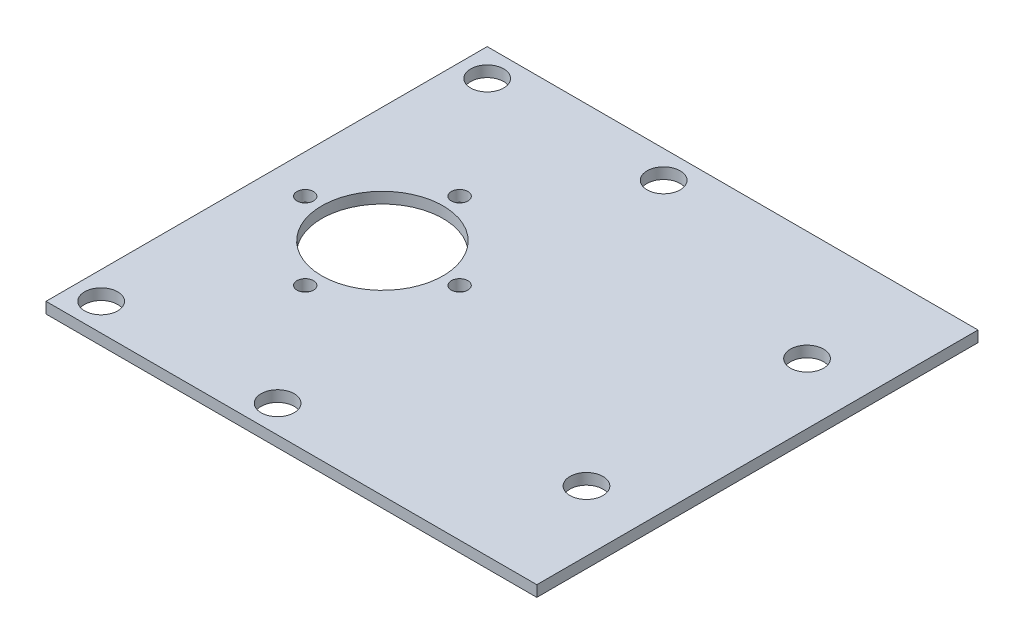
ISO-10303-21;
HEADER;
FILE_DESCRIPTION(('STEP AP214'),'2;1');
FILE_NAME('part.step','',(''),(''),'','','');
FILE_SCHEMA(('AUTOMOTIVE_DESIGN { 1 0 10303 214 1 1 1 1 }'));
ENDSEC;
DATA;
#1=APPLICATION_CONTEXT('core data for automotive mechanical design processes');
#2=APPLICATION_PROTOCOL_DEFINITION('international standard','automotive_design',2000,#1);
#3=PRODUCT_CONTEXT('',#1,'mechanical');
#4=PRODUCT('Part','Part','',(#3));
#5=PRODUCT_RELATED_PRODUCT_CATEGORY('part','',(#4));
#6=PRODUCT_DEFINITION_FORMATION('','',#4);
#7=PRODUCT_DEFINITION_CONTEXT('part definition',#1,'design');
#8=PRODUCT_DEFINITION('design','',#6,#7);
#9=PRODUCT_DEFINITION_SHAPE('','',#8);
#10=(LENGTH_UNIT() NAMED_UNIT(*) SI_UNIT(.MILLI.,.METRE.));
#11=(NAMED_UNIT(*) PLANE_ANGLE_UNIT() SI_UNIT($,.RADIAN.));
#12=(NAMED_UNIT(*) SI_UNIT($,.STERADIAN.) SOLID_ANGLE_UNIT());
#13=UNCERTAINTY_MEASURE_WITH_UNIT(LENGTH_MEASURE(1.E-05),#10,'distance_accuracy_value','');
#14=(GEOMETRIC_REPRESENTATION_CONTEXT(3) GLOBAL_UNCERTAINTY_ASSIGNED_CONTEXT((#13)) GLOBAL_UNIT_ASSIGNED_CONTEXT((#10,
#11,#12)) REPRESENTATION_CONTEXT('',''));
#15=CARTESIAN_POINT('',(0.,0.,0.));
#16=DIRECTION('',(0.,0.,1.));
#17=DIRECTION('',(1.,0.,0.));
#18=AXIS2_PLACEMENT_3D('',#15,#16,#17);
#19=CARTESIAN_POINT('',(0.,2.,0.));
#20=DIRECTION('',(1.,0.,0.));
#21=DIRECTION('',(0.,0.,-1.));
#22=AXIS2_PLACEMENT_3D('',#19,#20,#21);
#23=PLANE('',#22);
#24=DIRECTION('',(0.,0.,1.));
#25=VECTOR('',#24,1.);
#26=CARTESIAN_POINT('',(0.,0.,0.));
#27=LINE('',#26,#25);
#28=CARTESIAN_POINT('',(0.,0.,-80.));
#29=VERTEX_POINT('',#28);
#30=CARTESIAN_POINT('',(0.,0.,0.));
#31=VERTEX_POINT('',#30);
#32=EDGE_CURVE('E97',#29,#31,#27,.T.);
#33=ORIENTED_EDGE('',*,*,#32,.T.);
#34=DIRECTION('',(0.,-1.,0.));
#35=VECTOR('',#34,1.);
#36=CARTESIAN_POINT('',(0.,2.,0.));
#37=LINE('',#36,#35);
#38=CARTESIAN_POINT('',(0.,2.,0.));
#39=VERTEX_POINT('',#38);
#40=EDGE_CURVE('E11',#39,#31,#37,.T.);
#41=ORIENTED_EDGE('',*,*,#40,.F.);
#42=DIRECTION('',(0.,0.,1.));
#43=VECTOR('',#42,1.);
#44=CARTESIAN_POINT('',(0.,2.,0.));
#45=LINE('',#44,#43);
#46=CARTESIAN_POINT('',(0.,2.,-80.));
#47=VERTEX_POINT('',#46);
#48=EDGE_CURVE('E85',#47,#39,#45,.T.);
#49=ORIENTED_EDGE('',*,*,#48,.F.);
#50=DIRECTION('',(0.,-1.,0.));
#51=VECTOR('',#50,1.);
#52=CARTESIAN_POINT('',(0.,2.,-80.));
#53=LINE('',#52,#51);
#54=EDGE_CURVE('E93',#47,#29,#53,.T.);
#55=ORIENTED_EDGE('',*,*,#54,.T.);
#56=EDGE_LOOP('',(#33,#41,#49,#55));
#57=FACE_BOUND('',#56,.T.);
#58=ADVANCED_FACE('F34',(#57),#23,.F.);
#59=CARTESIAN_POINT('',(0.,2.,0.));
#60=DIRECTION('',(0.,0.,-1.));
#61=DIRECTION('',(-1.,0.,0.));
#62=AXIS2_PLACEMENT_3D('',#59,#60,#61);
#63=PLANE('',#62);
#64=DIRECTION('',(1.,0.,0.));
#65=VECTOR('',#64,1.);
#66=CARTESIAN_POINT('',(0.,0.,0.));
#67=LINE('',#66,#65);
#68=CARTESIAN_POINT('',(89.,0.,0.));
#69=VERTEX_POINT('',#68);
#70=EDGE_CURVE('E89',#31,#69,#67,.T.);
#71=ORIENTED_EDGE('',*,*,#70,.T.);
#72=DIRECTION('',(0.,-1.,0.));
#73=VECTOR('',#72,1.);
#74=CARTESIAN_POINT('',(89.,2.,0.));
#75=LINE('',#74,#73);
#76=CARTESIAN_POINT('',(89.,2.,0.));
#77=VERTEX_POINT('',#76);
#78=EDGE_CURVE('E42',#77,#69,#75,.T.);
#79=ORIENTED_EDGE('',*,*,#78,.F.);
#80=DIRECTION('',(1.,0.,0.));
#81=VECTOR('',#80,1.);
#82=CARTESIAN_POINT('',(0.,2.,0.));
#83=LINE('',#82,#81);
#84=EDGE_CURVE('E80',#39,#77,#83,.T.);
#85=ORIENTED_EDGE('',*,*,#84,.F.);
#86=ORIENTED_EDGE('',*,*,#40,.T.);
#87=EDGE_LOOP('',(#71,#79,#85,#86));
#88=FACE_BOUND('',#87,.T.);
#89=ADVANCED_FACE('F88',(#88),#63,.F.);
#90=CARTESIAN_POINT('',(89.,2.,0.));
#91=DIRECTION('',(-1.,0.,0.));
#92=DIRECTION('',(0.,0.,1.));
#93=AXIS2_PLACEMENT_3D('',#90,#91,#92);
#94=PLANE('',#93);
#95=DIRECTION('',(0.,0.,-1.));
#96=VECTOR('',#95,1.);
#97=CARTESIAN_POINT('',(89.,0.,0.));
#98=LINE('',#97,#96);
#99=CARTESIAN_POINT('',(89.,0.,-80.));
#100=VERTEX_POINT('',#99);
#101=EDGE_CURVE('E67',#69,#100,#98,.T.);
#102=ORIENTED_EDGE('',*,*,#101,.T.);
#103=DIRECTION('',(0.,-1.,0.));
#104=VECTOR('',#103,1.);
#105=CARTESIAN_POINT('',(89.,2.,-80.));
#106=LINE('',#105,#104);
#107=CARTESIAN_POINT('',(89.,2.,-80.));
#108=VERTEX_POINT('',#107);
#109=EDGE_CURVE('E90',#108,#100,#106,.T.);
#110=ORIENTED_EDGE('',*,*,#109,.F.);
#111=DIRECTION('',(0.,0.,-1.));
#112=VECTOR('',#111,1.);
#113=CARTESIAN_POINT('',(89.,2.,0.));
#114=LINE('',#113,#112);
#115=EDGE_CURVE('E83',#77,#108,#114,.T.);
#116=ORIENTED_EDGE('',*,*,#115,.F.);
#117=ORIENTED_EDGE('',*,*,#78,.T.);
#118=EDGE_LOOP('',(#102,#110,#116,#117));
#119=FACE_BOUND('',#118,.T.);
#120=ADVANCED_FACE('F91',(#119),#94,.F.);
#121=CARTESIAN_POINT('',(0.,2.,-80.));
#122=DIRECTION('',(0.,0.,1.));
#123=DIRECTION('',(1.,0.,0.));
#124=AXIS2_PLACEMENT_3D('',#121,#122,#123);
#125=PLANE('',#124);
#126=DIRECTION('',(-1.,0.,0.));
#127=VECTOR('',#126,1.);
#128=CARTESIAN_POINT('',(0.,0.,-80.));
#129=LINE('',#128,#127);
#130=EDGE_CURVE('E73',#100,#29,#129,.T.);
#131=ORIENTED_EDGE('',*,*,#130,.T.);
#132=ORIENTED_EDGE('',*,*,#54,.F.);
#133=DIRECTION('',(-1.,0.,0.));
#134=VECTOR('',#133,1.);
#135=CARTESIAN_POINT('',(0.,2.,-80.));
#136=LINE('',#135,#134);
#137=EDGE_CURVE('E50',#108,#47,#136,.T.);
#138=ORIENTED_EDGE('',*,*,#137,.F.);
#139=ORIENTED_EDGE('',*,*,#109,.T.);
#140=EDGE_LOOP('',(#131,#132,#138,#139));
#141=FACE_BOUND('',#140,.T.);
#142=ADVANCED_FACE('F105',(#141),#125,.F.);
#143=CARTESIAN_POINT('',(0.,2.,-80.));
#144=DIRECTION('',(0.,-1.,0.));
#145=DIRECTION('',(0.,0.,-1.));
#146=AXIS2_PLACEMENT_3D('',#143,#144,#145);
#147=PLANE('',#146);
#148=CARTESIAN_POINT('',(78.,2.,-20.));
#149=DIRECTION('',(0.,1.,0.));
#150=DIRECTION('',(0.,0.,-1.));
#151=AXIS2_PLACEMENT_3D('',#148,#149,#150);
#152=CIRCLE('',#151,3.00000000000001);
#153=CARTESIAN_POINT('',(78.,2.,-23.0000000000001));
#154=VERTEX_POINT('',#153);
#155=EDGE_CURVE('E171',#154,#154,#152,.T.);
#156=ORIENTED_EDGE('',*,*,#155,.F.);
#157=EDGE_LOOP('',(#156));
#158=FACE_BOUND('',#157,.T.);
#159=CARTESIAN_POINT('',(37.0000000000003,2.,-74.9999999999999));
#160=DIRECTION('',(0.,1.,0.));
#161=DIRECTION('',(0.,0.,-1.));
#162=AXIS2_PLACEMENT_3D('',#159,#160,#161);
#163=CIRCLE('',#162,3.00000000000001);
#164=CARTESIAN_POINT('',(37.0000000000003,2.,-77.9999999999999));
#165=VERTEX_POINT('',#164);
#166=EDGE_CURVE('E165',#165,#165,#163,.T.);
#167=ORIENTED_EDGE('',*,*,#166,.F.);
#168=EDGE_LOOP('',(#167));
#169=FACE_BOUND('',#168,.T.);
#170=CARTESIAN_POINT('',(37.,2.,-5.00000000000005));
#171=DIRECTION('',(0.,1.,0.));
#172=DIRECTION('',(0.,0.,1.));
#173=AXIS2_PLACEMENT_3D('',#170,#171,#172);
#174=CIRCLE('',#173,3.);
#175=CARTESIAN_POINT('',(37.,2.,-2.00000000000004));
#176=VERTEX_POINT('',#175);
#177=EDGE_CURVE('E159',#176,#176,#174,.T.);
#178=ORIENTED_EDGE('',*,*,#177,.F.);
#179=EDGE_LOOP('',(#178));
#180=FACE_BOUND('',#179,.T.);
#181=CARTESIAN_POINT('',(4.99999999999992,2.,-5.00000000000013));
#182=DIRECTION('',(0.,1.,0.));
#183=DIRECTION('',(0.,0.,-1.));
#184=AXIS2_PLACEMENT_3D('',#181,#182,#183);
#185=CIRCLE('',#184,3.);
#186=CARTESIAN_POINT('',(4.99999999999992,2.,-8.00000000000013));
#187=VERTEX_POINT('',#186);
#188=EDGE_CURVE('E153',#187,#187,#185,.T.);
#189=ORIENTED_EDGE('',*,*,#188,.F.);
#190=EDGE_LOOP('',(#189));
#191=FACE_BOUND('',#190,.T.);
#192=CARTESIAN_POINT('',(78.,2.,-60.));
#193=DIRECTION('',(0.,1.,0.));
#194=DIRECTION('',(0.,0.,1.));
#195=AXIS2_PLACEMENT_3D('',#192,#193,#194);
#196=CIRCLE('',#195,3.00000000000001);
#197=CARTESIAN_POINT('',(78.,2.,-57.));
#198=VERTEX_POINT('',#197);
#199=EDGE_CURVE('E147',#198,#198,#196,.T.);
#200=ORIENTED_EDGE('',*,*,#199,.F.);
#201=EDGE_LOOP('',(#200));
#202=FACE_BOUND('',#201,.T.);
#203=CARTESIAN_POINT('',(21.0000000000001,2.,-54.));
#204=DIRECTION('',(0.,1.,0.));
#205=DIRECTION('',(0.,0.,1.));
#206=AXIS2_PLACEMENT_3D('',#203,#204,#205);
#207=CIRCLE('',#206,1.5);
#208=CARTESIAN_POINT('',(21.0000000000001,2.,-52.5));
#209=VERTEX_POINT('',#208);
#210=EDGE_CURVE('E141',#209,#209,#207,.T.);
#211=ORIENTED_EDGE('',*,*,#210,.F.);
#212=EDGE_LOOP('',(#211));
#213=FACE_BOUND('',#212,.T.);
#214=CARTESIAN_POINT('',(7.00000000000001,2.,-40.0000000000001));
#215=DIRECTION('',(0.,1.,0.));
#216=DIRECTION('',(0.,0.,1.));
#217=AXIS2_PLACEMENT_3D('',#214,#215,#216);
#218=CIRCLE('',#217,1.5);
#219=CARTESIAN_POINT('',(7.00000000000001,2.,-38.5000000000001));
#220=VERTEX_POINT('',#219);
#221=EDGE_CURVE('E135',#220,#220,#218,.T.);
#222=ORIENTED_EDGE('',*,*,#221,.F.);
#223=EDGE_LOOP('',(#222));
#224=FACE_BOUND('',#223,.T.);
#225=CARTESIAN_POINT('',(21.,2.,-26.));
#226=DIRECTION('',(0.,1.,0.));
#227=DIRECTION('',(0.,0.,1.));
#228=AXIS2_PLACEMENT_3D('',#225,#226,#227);
#229=CIRCLE('',#228,1.5);
#230=CARTESIAN_POINT('',(21.,2.,-24.5));
#231=VERTEX_POINT('',#230);
#232=EDGE_CURVE('E129',#231,#231,#229,.T.);
#233=ORIENTED_EDGE('',*,*,#232,.F.);
#234=EDGE_LOOP('',(#233));
#235=FACE_BOUND('',#234,.T.);
#236=CARTESIAN_POINT('',(5.,2.,-75.));
#237=DIRECTION('',(0.,1.,0.));
#238=DIRECTION('',(0.,0.,1.));
#239=AXIS2_PLACEMENT_3D('',#236,#237,#238);
#240=CIRCLE('',#239,3.);
#241=CARTESIAN_POINT('',(5.,2.,-72.));
#242=VERTEX_POINT('',#241);
#243=EDGE_CURVE('E123',#242,#242,#240,.T.);
#244=ORIENTED_EDGE('',*,*,#243,.F.);
#245=EDGE_LOOP('',(#244));
#246=FACE_BOUND('',#245,.T.);
#247=CARTESIAN_POINT('',(35.,2.,-40.));
#248=DIRECTION('',(0.,1.,0.));
#249=DIRECTION('',(0.,0.,1.));
#250=AXIS2_PLACEMENT_3D('',#247,#248,#249);
#251=CIRCLE('',#250,1.5);
#252=CARTESIAN_POINT('',(35.,2.,-38.5));
#253=VERTEX_POINT('',#252);
#254=EDGE_CURVE('E117',#253,#253,#251,.T.);
#255=ORIENTED_EDGE('',*,*,#254,.F.);
#256=EDGE_LOOP('',(#255));
#257=FACE_BOUND('',#256,.T.);
#258=CARTESIAN_POINT('',(21.,2.,-40.));
#259=DIRECTION('',(0.,1.,0.));
#260=DIRECTION('',(0.,0.,1.));
#261=AXIS2_PLACEMENT_3D('',#258,#259,#260);
#262=CIRCLE('',#261,11.);
#263=CARTESIAN_POINT('',(21.,2.,-29.));
#264=VERTEX_POINT('',#263);
#265=EDGE_CURVE('E111',#264,#264,#262,.T.);
#266=ORIENTED_EDGE('',*,*,#265,.F.);
#267=EDGE_LOOP('',(#266));
#268=FACE_BOUND('',#267,.T.);
#269=ORIENTED_EDGE('',*,*,#48,.T.);
#270=ORIENTED_EDGE('',*,*,#84,.T.);
#271=ORIENTED_EDGE('',*,*,#115,.T.);
#272=ORIENTED_EDGE('',*,*,#137,.T.);
#273=EDGE_LOOP('',(#269,#270,#271,#272));
#274=FACE_BOUND('',#273,.T.);
#275=ADVANCED_FACE('F81',(#158,#169,#180,#191,#202,#213,#224,#235,#246,#257,#268,#274),#147,.F.);
#276=CARTESIAN_POINT('',(0.,0.,-80.));
#277=DIRECTION('',(0.,-1.,0.));
#278=DIRECTION('',(0.,0.,-1.));
#279=AXIS2_PLACEMENT_3D('',#276,#277,#278);
#280=PLANE('',#279);
#281=CARTESIAN_POINT('',(78.,0.,-20.));
#282=DIRECTION('',(0.,1.,0.));
#283=DIRECTION('',(0.,0.,-1.));
#284=AXIS2_PLACEMENT_3D('',#281,#282,#283);
#285=CIRCLE('',#284,3.00000000000001);
#286=CARTESIAN_POINT('',(78.,0.,-23.0000000000001));
#287=VERTEX_POINT('',#286);
#288=EDGE_CURVE('E168',#287,#287,#285,.T.);
#289=ORIENTED_EDGE('',*,*,#288,.T.);
#290=EDGE_LOOP('',(#289));
#291=FACE_BOUND('',#290,.T.);
#292=CARTESIAN_POINT('',(37.0000000000003,0.,-74.9999999999999));
#293=DIRECTION('',(0.,1.,0.));
#294=DIRECTION('',(0.,0.,-1.));
#295=AXIS2_PLACEMENT_3D('',#292,#293,#294);
#296=CIRCLE('',#295,3.00000000000001);
#297=CARTESIAN_POINT('',(37.0000000000003,0.,-77.9999999999999));
#298=VERTEX_POINT('',#297);
#299=EDGE_CURVE('E162',#298,#298,#296,.T.);
#300=ORIENTED_EDGE('',*,*,#299,.T.);
#301=EDGE_LOOP('',(#300));
#302=FACE_BOUND('',#301,.T.);
#303=CARTESIAN_POINT('',(37.,0.,-5.00000000000005));
#304=DIRECTION('',(0.,1.,0.));
#305=DIRECTION('',(0.,0.,1.));
#306=AXIS2_PLACEMENT_3D('',#303,#304,#305);
#307=CIRCLE('',#306,3.);
#308=CARTESIAN_POINT('',(37.,0.,-2.00000000000004));
#309=VERTEX_POINT('',#308);
#310=EDGE_CURVE('E156',#309,#309,#307,.T.);
#311=ORIENTED_EDGE('',*,*,#310,.T.);
#312=EDGE_LOOP('',(#311));
#313=FACE_BOUND('',#312,.T.);
#314=CARTESIAN_POINT('',(4.99999999999992,0.,-5.00000000000013));
#315=DIRECTION('',(0.,1.,0.));
#316=DIRECTION('',(0.,0.,-1.));
#317=AXIS2_PLACEMENT_3D('',#314,#315,#316);
#318=CIRCLE('',#317,3.);
#319=CARTESIAN_POINT('',(4.99999999999992,0.,-8.00000000000013));
#320=VERTEX_POINT('',#319);
#321=EDGE_CURVE('E150',#320,#320,#318,.T.);
#322=ORIENTED_EDGE('',*,*,#321,.T.);
#323=EDGE_LOOP('',(#322));
#324=FACE_BOUND('',#323,.T.);
#325=CARTESIAN_POINT('',(78.,0.,-60.));
#326=DIRECTION('',(0.,1.,0.));
#327=DIRECTION('',(0.,0.,1.));
#328=AXIS2_PLACEMENT_3D('',#325,#326,#327);
#329=CIRCLE('',#328,3.00000000000001);
#330=CARTESIAN_POINT('',(78.,0.,-57.));
#331=VERTEX_POINT('',#330);
#332=EDGE_CURVE('E144',#331,#331,#329,.T.);
#333=ORIENTED_EDGE('',*,*,#332,.T.);
#334=EDGE_LOOP('',(#333));
#335=FACE_BOUND('',#334,.T.);
#336=CARTESIAN_POINT('',(21.0000000000001,0.,-54.));
#337=DIRECTION('',(0.,1.,0.));
#338=DIRECTION('',(0.,0.,1.));
#339=AXIS2_PLACEMENT_3D('',#336,#337,#338);
#340=CIRCLE('',#339,1.5);
#341=CARTESIAN_POINT('',(21.0000000000001,0.,-52.5));
#342=VERTEX_POINT('',#341);
#343=EDGE_CURVE('E138',#342,#342,#340,.T.);
#344=ORIENTED_EDGE('',*,*,#343,.T.);
#345=EDGE_LOOP('',(#344));
#346=FACE_BOUND('',#345,.T.);
#347=CARTESIAN_POINT('',(7.00000000000001,0.,-40.0000000000001));
#348=DIRECTION('',(0.,1.,0.));
#349=DIRECTION('',(0.,0.,1.));
#350=AXIS2_PLACEMENT_3D('',#347,#348,#349);
#351=CIRCLE('',#350,1.5);
#352=CARTESIAN_POINT('',(7.00000000000001,0.,-38.5000000000001));
#353=VERTEX_POINT('',#352);
#354=EDGE_CURVE('E132',#353,#353,#351,.T.);
#355=ORIENTED_EDGE('',*,*,#354,.T.);
#356=EDGE_LOOP('',(#355));
#357=FACE_BOUND('',#356,.T.);
#358=CARTESIAN_POINT('',(21.,0.,-26.));
#359=DIRECTION('',(0.,1.,0.));
#360=DIRECTION('',(0.,0.,1.));
#361=AXIS2_PLACEMENT_3D('',#358,#359,#360);
#362=CIRCLE('',#361,1.5);
#363=CARTESIAN_POINT('',(21.,0.,-24.5));
#364=VERTEX_POINT('',#363);
#365=EDGE_CURVE('E126',#364,#364,#362,.T.);
#366=ORIENTED_EDGE('',*,*,#365,.T.);
#367=EDGE_LOOP('',(#366));
#368=FACE_BOUND('',#367,.T.);
#369=CARTESIAN_POINT('',(5.,0.,-75.));
#370=DIRECTION('',(0.,1.,0.));
#371=DIRECTION('',(0.,0.,1.));
#372=AXIS2_PLACEMENT_3D('',#369,#370,#371);
#373=CIRCLE('',#372,3.);
#374=CARTESIAN_POINT('',(5.,0.,-72.));
#375=VERTEX_POINT('',#374);
#376=EDGE_CURVE('E120',#375,#375,#373,.T.);
#377=ORIENTED_EDGE('',*,*,#376,.T.);
#378=EDGE_LOOP('',(#377));
#379=FACE_BOUND('',#378,.T.);
#380=CARTESIAN_POINT('',(35.,0.,-40.));
#381=DIRECTION('',(0.,1.,0.));
#382=DIRECTION('',(0.,0.,1.));
#383=AXIS2_PLACEMENT_3D('',#380,#381,#382);
#384=CIRCLE('',#383,1.5);
#385=CARTESIAN_POINT('',(35.,0.,-38.5));
#386=VERTEX_POINT('',#385);
#387=EDGE_CURVE('E114',#386,#386,#384,.T.);
#388=ORIENTED_EDGE('',*,*,#387,.T.);
#389=EDGE_LOOP('',(#388));
#390=FACE_BOUND('',#389,.T.);
#391=CARTESIAN_POINT('',(21.,0.,-40.));
#392=DIRECTION('',(0.,1.,0.));
#393=DIRECTION('',(0.,0.,1.));
#394=AXIS2_PLACEMENT_3D('',#391,#392,#393);
#395=CIRCLE('',#394,11.);
#396=CARTESIAN_POINT('',(21.,0.,-29.));
#397=VERTEX_POINT('',#396);
#398=EDGE_CURVE('E100',#397,#397,#395,.T.);
#399=ORIENTED_EDGE('',*,*,#398,.T.);
#400=EDGE_LOOP('',(#399));
#401=FACE_BOUND('',#400,.T.);
#402=ORIENTED_EDGE('',*,*,#32,.F.);
#403=ORIENTED_EDGE('',*,*,#130,.F.);
#404=ORIENTED_EDGE('',*,*,#101,.F.);
#405=ORIENTED_EDGE('',*,*,#70,.F.);
#406=EDGE_LOOP('',(#402,#403,#404,#405));
#407=FACE_BOUND('',#406,.T.);
#408=ADVANCED_FACE('F108',(#291,#302,#313,#324,#335,#346,#357,#368,#379,#390,#401,#407),#280,.T.);
#409=CARTESIAN_POINT('',(21.,0.,-40.));
#410=DIRECTION('',(0.,1.,0.));
#411=DIRECTION('',(0.,0.,1.));
#412=AXIS2_PLACEMENT_3D('',#409,#410,#411);
#413=CYLINDRICAL_SURFACE('',#412,11.);
#414=ORIENTED_EDGE('',*,*,#398,.F.);
#415=EDGE_LOOP('',(#414));
#416=FACE_BOUND('',#415,.T.);
#417=ORIENTED_EDGE('',*,*,#265,.T.);
#418=EDGE_LOOP('',(#417));
#419=FACE_BOUND('',#418,.T.);
#420=ADVANCED_FACE('F209',(#416,#419),#413,.F.);
#421=CARTESIAN_POINT('',(35.,0.,-40.));
#422=DIRECTION('',(0.,1.,0.));
#423=DIRECTION('',(0.,0.,1.));
#424=AXIS2_PLACEMENT_3D('',#421,#422,#423);
#425=CYLINDRICAL_SURFACE('',#424,1.5);
#426=ORIENTED_EDGE('',*,*,#387,.F.);
#427=EDGE_LOOP('',(#426));
#428=FACE_BOUND('',#427,.T.);
#429=ORIENTED_EDGE('',*,*,#254,.T.);
#430=EDGE_LOOP('',(#429));
#431=FACE_BOUND('',#430,.T.);
#432=ADVANCED_FACE('F211',(#428,#431),#425,.F.);
#433=CARTESIAN_POINT('',(5.,0.,-75.));
#434=DIRECTION('',(0.,1.,0.));
#435=DIRECTION('',(0.,0.,1.));
#436=AXIS2_PLACEMENT_3D('',#433,#434,#435);
#437=CYLINDRICAL_SURFACE('',#436,3.);
#438=ORIENTED_EDGE('',*,*,#376,.F.);
#439=EDGE_LOOP('',(#438));
#440=FACE_BOUND('',#439,.T.);
#441=ORIENTED_EDGE('',*,*,#243,.T.);
#442=EDGE_LOOP('',(#441));
#443=FACE_BOUND('',#442,.T.);
#444=ADVANCED_FACE('F218',(#440,#443),#437,.F.);
#445=CARTESIAN_POINT('',(21.,0.,-26.));
#446=DIRECTION('',(0.,1.,0.));
#447=DIRECTION('',(0.,0.,1.));
#448=AXIS2_PLACEMENT_3D('',#445,#446,#447);
#449=CYLINDRICAL_SURFACE('',#448,1.5);
#450=ORIENTED_EDGE('',*,*,#365,.F.);
#451=EDGE_LOOP('',(#450));
#452=FACE_BOUND('',#451,.T.);
#453=ORIENTED_EDGE('',*,*,#232,.T.);
#454=EDGE_LOOP('',(#453));
#455=FACE_BOUND('',#454,.T.);
#456=ADVANCED_FACE('F263',(#452,#455),#449,.F.);
#457=CARTESIAN_POINT('',(7.00000000000001,0.,-40.0000000000001));
#458=DIRECTION('',(0.,1.,0.));
#459=DIRECTION('',(0.,0.,1.));
#460=AXIS2_PLACEMENT_3D('',#457,#458,#459);
#461=CYLINDRICAL_SURFACE('',#460,1.5);
#462=ORIENTED_EDGE('',*,*,#354,.F.);
#463=EDGE_LOOP('',(#462));
#464=FACE_BOUND('',#463,.T.);
#465=ORIENTED_EDGE('',*,*,#221,.T.);
#466=EDGE_LOOP('',(#465));
#467=FACE_BOUND('',#466,.T.);
#468=ADVANCED_FACE('F273',(#464,#467),#461,.F.);
#469=CARTESIAN_POINT('',(21.0000000000001,0.,-54.));
#470=DIRECTION('',(0.,1.,0.));
#471=DIRECTION('',(0.,0.,1.));
#472=AXIS2_PLACEMENT_3D('',#469,#470,#471);
#473=CYLINDRICAL_SURFACE('',#472,1.5);
#474=ORIENTED_EDGE('',*,*,#343,.F.);
#475=EDGE_LOOP('',(#474));
#476=FACE_BOUND('',#475,.T.);
#477=ORIENTED_EDGE('',*,*,#210,.T.);
#478=EDGE_LOOP('',(#477));
#479=FACE_BOUND('',#478,.T.);
#480=ADVANCED_FACE('F283',(#476,#479),#473,.F.);
#481=CARTESIAN_POINT('',(78.,0.,-60.));
#482=DIRECTION('',(0.,1.,0.));
#483=DIRECTION('',(0.,0.,1.));
#484=AXIS2_PLACEMENT_3D('',#481,#482,#483);
#485=CYLINDRICAL_SURFACE('',#484,3.00000000000001);
#486=ORIENTED_EDGE('',*,*,#332,.F.);
#487=EDGE_LOOP('',(#486));
#488=FACE_BOUND('',#487,.T.);
#489=ORIENTED_EDGE('',*,*,#199,.T.);
#490=EDGE_LOOP('',(#489));
#491=FACE_BOUND('',#490,.T.);
#492=ADVANCED_FACE('F293',(#488,#491),#485,.F.);
#493=CARTESIAN_POINT('',(4.99999999999992,0.,-5.00000000000013));
#494=DIRECTION('',(0.,1.,0.));
#495=DIRECTION('',(0.,0.,1.));
#496=AXIS2_PLACEMENT_3D('',#493,#494,#495);
#497=CYLINDRICAL_SURFACE('',#496,3.);
#498=ORIENTED_EDGE('',*,*,#321,.F.);
#499=EDGE_LOOP('',(#498));
#500=FACE_BOUND('',#499,.T.);
#501=ORIENTED_EDGE('',*,*,#188,.T.);
#502=EDGE_LOOP('',(#501));
#503=FACE_BOUND('',#502,.T.);
#504=ADVANCED_FACE('F303',(#500,#503),#497,.F.);
#505=CARTESIAN_POINT('',(37.,0.,-5.00000000000005));
#506=DIRECTION('',(0.,1.,0.));
#507=DIRECTION('',(0.,0.,1.));
#508=AXIS2_PLACEMENT_3D('',#505,#506,#507);
#509=CYLINDRICAL_SURFACE('',#508,3.);
#510=ORIENTED_EDGE('',*,*,#310,.F.);
#511=EDGE_LOOP('',(#510));
#512=FACE_BOUND('',#511,.T.);
#513=ORIENTED_EDGE('',*,*,#177,.T.);
#514=EDGE_LOOP('',(#513));
#515=FACE_BOUND('',#514,.T.);
#516=ADVANCED_FACE('F313',(#512,#515),#509,.F.);
#517=CARTESIAN_POINT('',(37.0000000000003,0.,-74.9999999999999));
#518=DIRECTION('',(0.,1.,0.));
#519=DIRECTION('',(0.,0.,1.));
#520=AXIS2_PLACEMENT_3D('',#517,#518,#519);
#521=CYLINDRICAL_SURFACE('',#520,3.00000000000001);
#522=ORIENTED_EDGE('',*,*,#299,.F.);
#523=EDGE_LOOP('',(#522));
#524=FACE_BOUND('',#523,.T.);
#525=ORIENTED_EDGE('',*,*,#166,.T.);
#526=EDGE_LOOP('',(#525));
#527=FACE_BOUND('',#526,.T.);
#528=ADVANCED_FACE('F182',(#524,#527),#521,.F.);
#529=CARTESIAN_POINT('',(78.,0.,-20.));
#530=DIRECTION('',(0.,1.,0.));
#531=DIRECTION('',(0.,0.,1.));
#532=AXIS2_PLACEMENT_3D('',#529,#530,#531);
#533=CYLINDRICAL_SURFACE('',#532,3.00000000000001);
#534=ORIENTED_EDGE('',*,*,#288,.F.);
#535=EDGE_LOOP('',(#534));
#536=FACE_BOUND('',#535,.T.);
#537=ORIENTED_EDGE('',*,*,#155,.T.);
#538=EDGE_LOOP('',(#537));
#539=FACE_BOUND('',#538,.T.);
#540=ADVANCED_FACE('F179',(#536,#539),#533,.F.);
#541=CLOSED_SHELL('',(#58,#89,#120,#142,#275,#408,#420,#432,#444,#456,#468,#480,#492,#504,#516,
#528,#540));
#542=MANIFOLD_SOLID_BREP('B2',#541);
#543=ADVANCED_BREP_SHAPE_REPRESENTATION('',(#18,#542),#14);
#544=SHAPE_DEFINITION_REPRESENTATION(#9,#543);
ENDSEC;
END-ISO-10303-21;
